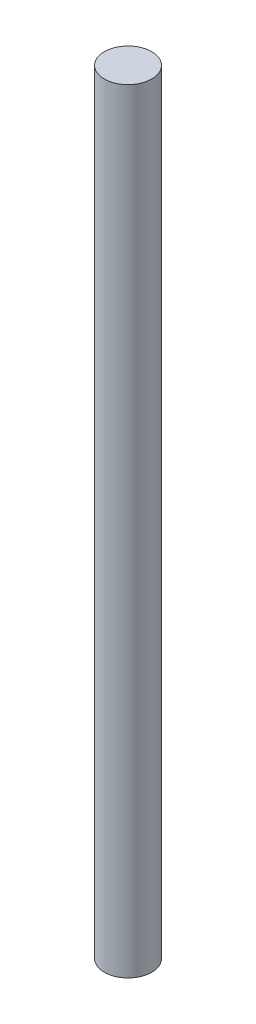
ISO-10303-21;
HEADER;
FILE_DESCRIPTION(('STEP AP214'),'2;1');
FILE_NAME('part.step','',(''),(''),'','','');
FILE_SCHEMA(('AUTOMOTIVE_DESIGN { 1 0 10303 214 1 1 1 1 }'));
ENDSEC;
DATA;
#1=APPLICATION_CONTEXT('core data for automotive mechanical design processes');
#2=APPLICATION_PROTOCOL_DEFINITION('international standard','automotive_design',2000,#1);
#3=PRODUCT_CONTEXT('',#1,'mechanical');
#4=PRODUCT('Part','Part','',(#3));
#5=PRODUCT_RELATED_PRODUCT_CATEGORY('part','',(#4));
#6=PRODUCT_DEFINITION_FORMATION('','',#4);
#7=PRODUCT_DEFINITION_CONTEXT('part definition',#1,'design');
#8=PRODUCT_DEFINITION('design','',#6,#7);
#9=PRODUCT_DEFINITION_SHAPE('','',#8);
#10=(LENGTH_UNIT() NAMED_UNIT(*) SI_UNIT(.MILLI.,.METRE.));
#11=(NAMED_UNIT(*) PLANE_ANGLE_UNIT() SI_UNIT($,.RADIAN.));
#12=(NAMED_UNIT(*) SI_UNIT($,.STERADIAN.) SOLID_ANGLE_UNIT());
#13=UNCERTAINTY_MEASURE_WITH_UNIT(LENGTH_MEASURE(1.E-05),#10,'distance_accuracy_value','');
#14=(GEOMETRIC_REPRESENTATION_CONTEXT(3) GLOBAL_UNCERTAINTY_ASSIGNED_CONTEXT((#13)) GLOBAL_UNIT_ASSIGNED_CONTEXT((#10,
#11,#12)) REPRESENTATION_CONTEXT('',''));
#15=CARTESIAN_POINT('',(0.,0.,0.));
#16=DIRECTION('',(0.,0.,1.));
#17=DIRECTION('',(1.,0.,0.));
#18=AXIS2_PLACEMENT_3D('',#15,#16,#17);
#19=CARTESIAN_POINT('',(0.,49.,0.));
#20=DIRECTION('',(0.,1.,0.));
#21=DIRECTION('',(0.,0.,1.));
#22=AXIS2_PLACEMENT_3D('',#19,#20,#21);
#23=PLANE('',#22);
#24=CARTESIAN_POINT('',(0.,49.,0.));
#25=DIRECTION('',(0.,-1.,0.));
#26=DIRECTION('',(0.,0.,-1.));
#27=AXIS2_PLACEMENT_3D('',#24,#25,#26);
#28=CIRCLE('',#27,1.5);
#29=CARTESIAN_POINT('',(0.,49.,-1.5));
#30=VERTEX_POINT('',#29);
#31=EDGE_CURVE('E18',#30,#30,#28,.T.);
#32=ORIENTED_EDGE('',*,*,#31,.F.);
#33=EDGE_LOOP('',(#32));
#34=FACE_BOUND('',#33,.T.);
#35=ADVANCED_FACE('F15',(#34),#23,.T.);
#36=CARTESIAN_POINT('',(0.,0.,0.));
#37=DIRECTION('',(0.,1.,0.));
#38=DIRECTION('',(0.,0.,1.));
#39=AXIS2_PLACEMENT_3D('',#36,#37,#38);
#40=PLANE('',#39);
#41=CARTESIAN_POINT('',(0.,0.,0.));
#42=DIRECTION('',(0.,-1.,0.));
#43=DIRECTION('',(0.,0.,-1.));
#44=AXIS2_PLACEMENT_3D('',#41,#42,#43);
#45=CIRCLE('',#44,1.5);
#46=CARTESIAN_POINT('',(0.,0.,-1.5));
#47=VERTEX_POINT('',#46);
#48=EDGE_CURVE('E10',#47,#47,#45,.F.);
#49=ORIENTED_EDGE('',*,*,#48,.F.);
#50=EDGE_LOOP('',(#49));
#51=FACE_BOUND('',#50,.T.);
#52=ADVANCED_FACE('F30',(#51),#40,.F.);
#53=CARTESIAN_POINT('',(0.,49.,0.));
#54=DIRECTION('',(0.,-1.,0.));
#55=DIRECTION('',(0.,0.,-1.));
#56=AXIS2_PLACEMENT_3D('',#53,#54,#55);
#57=CYLINDRICAL_SURFACE('',#56,1.5);
#58=ORIENTED_EDGE('',*,*,#48,.T.);
#59=EDGE_LOOP('',(#58));
#60=FACE_BOUND('',#59,.T.);
#61=ORIENTED_EDGE('',*,*,#31,.T.);
#62=EDGE_LOOP('',(#61));
#63=FACE_BOUND('',#62,.T.);
#64=ADVANCED_FACE('F27',(#60,#63),#57,.T.);
#65=CLOSED_SHELL('',(#35,#52,#64));
#66=MANIFOLD_SOLID_BREP('B1',#65);
#67=ADVANCED_BREP_SHAPE_REPRESENTATION('',(#18,#66),#14);
#68=SHAPE_DEFINITION_REPRESENTATION(#9,#67);
ENDSEC;
END-ISO-10303-21;
